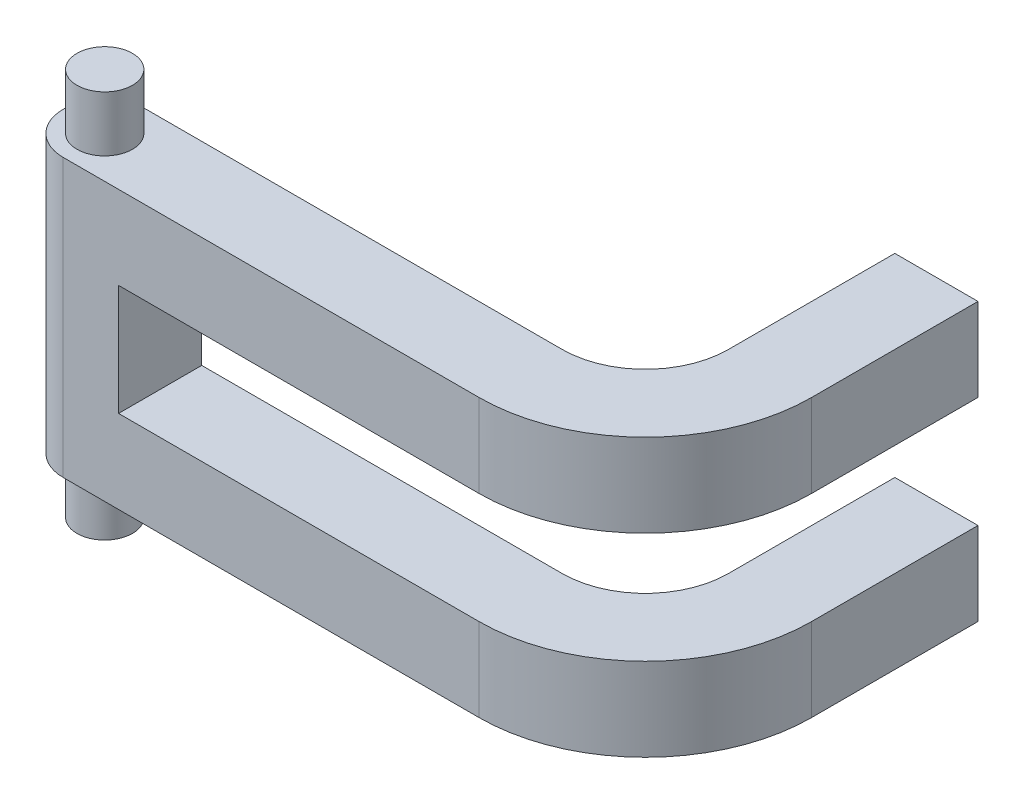
ISO-10303-21;
HEADER;
FILE_DESCRIPTION(('STEP AP214'),'2;1');
FILE_NAME('part.step','',(''),(''),'','','');
FILE_SCHEMA(('AUTOMOTIVE_DESIGN { 1 0 10303 214 1 1 1 1 }'));
ENDSEC;
DATA;
#1=APPLICATION_CONTEXT('core data for automotive mechanical design processes');
#2=APPLICATION_PROTOCOL_DEFINITION('international standard','automotive_design',2000,#1);
#3=PRODUCT_CONTEXT('',#1,'mechanical');
#4=PRODUCT('Part','Part','',(#3));
#5=PRODUCT_RELATED_PRODUCT_CATEGORY('part','',(#4));
#6=PRODUCT_DEFINITION_FORMATION('','',#4);
#7=PRODUCT_DEFINITION_CONTEXT('part definition',#1,'design');
#8=PRODUCT_DEFINITION('design','',#6,#7);
#9=PRODUCT_DEFINITION_SHAPE('','',#8);
#10=(LENGTH_UNIT() NAMED_UNIT(*) SI_UNIT(.MILLI.,.METRE.));
#11=(NAMED_UNIT(*) PLANE_ANGLE_UNIT() SI_UNIT($,.RADIAN.));
#12=(NAMED_UNIT(*) SI_UNIT($,.STERADIAN.) SOLID_ANGLE_UNIT());
#13=UNCERTAINTY_MEASURE_WITH_UNIT(LENGTH_MEASURE(1.E-05),#10,'distance_accuracy_value','');
#14=(GEOMETRIC_REPRESENTATION_CONTEXT(3) GLOBAL_UNCERTAINTY_ASSIGNED_CONTEXT((#13)) GLOBAL_UNIT_ASSIGNED_CONTEXT((#10,
#11,#12)) REPRESENTATION_CONTEXT('',''));
#15=CARTESIAN_POINT('',(0.,0.,0.));
#16=DIRECTION('',(0.,0.,1.));
#17=DIRECTION('',(1.,0.,0.));
#18=AXIS2_PLACEMENT_3D('',#15,#16,#17);
#19=CARTESIAN_POINT('',(75.,-7.5,-30.));
#20=DIRECTION('',(0.,1.,0.));
#21=DIRECTION('',(0.,0.,1.));
#22=AXIS2_PLACEMENT_3D('',#19,#20,#21);
#23=CYLINDRICAL_SURFACE('',#22,15.);
#24=DIRECTION('',(0.,1.,0.));
#25=VECTOR('',#24,1.);
#26=CARTESIAN_POINT('',(90.,-7.5,-30.0000000000001));
#27=LINE('',#26,#25);
#28=CARTESIAN_POINT('',(90.,27.5,-30.0000000000001));
#29=VERTEX_POINT('',#28);
#30=CARTESIAN_POINT('',(90.,42.4982685723538,-30.0000000000001));
#31=VERTEX_POINT('',#30);
#32=EDGE_CURVE('E293',#29,#31,#27,.T.);
#33=ORIENTED_EDGE('',*,*,#32,.F.);
#34=CARTESIAN_POINT('',(75.,27.5,-30.));
#35=DIRECTION('',(0.,-1.,0.));
#36=DIRECTION('',(0.,0.,-1.));
#37=AXIS2_PLACEMENT_3D('',#34,#35,#36);
#38=CIRCLE('',#37,15.);
#39=CARTESIAN_POINT('',(75.,27.5,-15.));
#40=VERTEX_POINT('',#39);
#41=EDGE_CURVE('E181',#29,#40,#38,.T.);
#42=ORIENTED_EDGE('',*,*,#41,.T.);
#43=DIRECTION('',(0.,1.,0.));
#44=VECTOR('',#43,1.);
#45=CARTESIAN_POINT('',(75.,-7.5,-15.));
#46=LINE('',#45,#44);
#47=CARTESIAN_POINT('',(75.,42.4982685723538,-15.));
#48=VERTEX_POINT('',#47);
#49=EDGE_CURVE('E178',#40,#48,#46,.T.);
#50=ORIENTED_EDGE('',*,*,#49,.T.);
#51=CARTESIAN_POINT('',(75.,42.4982685723538,-30.));
#52=DIRECTION('',(0.,-1.,0.));
#53=DIRECTION('',(0.,0.,1.));
#54=AXIS2_PLACEMENT_3D('',#51,#52,#53);
#55=CIRCLE('',#54,15.);
#56=EDGE_CURVE('E243',#31,#48,#55,.T.);
#57=ORIENTED_EDGE('',*,*,#56,.F.);
#58=EDGE_LOOP('',(#33,#42,#50,#57));
#59=FACE_BOUND('',#58,.T.);
#60=ADVANCED_FACE('F40',(#59),#23,.F.);
#61=CARTESIAN_POINT('',(90.,-7.5,-30.0000000000001));
#62=DIRECTION('',(-1.,0.,0.));
#63=DIRECTION('',(0.,0.,1.));
#64=AXIS2_PLACEMENT_3D('',#61,#62,#63);
#65=PLANE('',#64);
#66=DIRECTION('',(0.,1.,0.));
#67=VECTOR('',#66,1.);
#68=CARTESIAN_POINT('',(90.,-7.5,-60.));
#69=LINE('',#68,#67);
#70=CARTESIAN_POINT('',(90.,27.5,-60.));
#71=VERTEX_POINT('',#70);
#72=CARTESIAN_POINT('',(90.,42.4982685723538,-60.));
#73=VERTEX_POINT('',#72);
#74=EDGE_CURVE('E298',#71,#73,#69,.T.);
#75=ORIENTED_EDGE('',*,*,#74,.F.);
#76=DIRECTION('',(0.,0.,1.));
#77=VECTOR('',#76,1.);
#78=CARTESIAN_POINT('',(90.,27.5,-30.0000000000001));
#79=LINE('',#78,#77);
#80=EDGE_CURVE('E187',#71,#29,#79,.T.);
#81=ORIENTED_EDGE('',*,*,#80,.T.);
#82=ORIENTED_EDGE('',*,*,#32,.T.);
#83=DIRECTION('',(0.,0.,1.));
#84=VECTOR('',#83,1.);
#85=CARTESIAN_POINT('',(90.,42.4982685723538,-30.0000000000001));
#86=LINE('',#85,#84);
#87=EDGE_CURVE('E239',#73,#31,#86,.T.);
#88=ORIENTED_EDGE('',*,*,#87,.F.);
#89=EDGE_LOOP('',(#75,#81,#82,#88));
#90=FACE_BOUND('',#89,.T.);
#91=ADVANCED_FACE('F374',(#90),#65,.T.);
#92=CARTESIAN_POINT('',(105.,-7.5,-60.));
#93=DIRECTION('',(0.,0.,-1.));
#94=DIRECTION('',(-1.,0.,0.));
#95=AXIS2_PLACEMENT_3D('',#92,#93,#94);
#96=PLANE('',#95);
#97=DIRECTION('',(0.,1.,0.));
#98=VECTOR('',#97,1.);
#99=CARTESIAN_POINT('',(105.,-7.5,-60.));
#100=LINE('',#99,#98);
#101=CARTESIAN_POINT('',(105.,27.5,-60.));
#102=VERTEX_POINT('',#101);
#103=CARTESIAN_POINT('',(105.,42.4982685723538,-60.));
#104=VERTEX_POINT('',#103);
#105=EDGE_CURVE('E303',#102,#104,#100,.T.);
#106=ORIENTED_EDGE('',*,*,#105,.F.);
#107=DIRECTION('',(-1.,0.,0.));
#108=VECTOR('',#107,1.);
#109=CARTESIAN_POINT('',(105.,27.5,-60.));
#110=LINE('',#109,#108);
#111=EDGE_CURVE('E377',#102,#71,#110,.T.);
#112=ORIENTED_EDGE('',*,*,#111,.T.);
#113=ORIENTED_EDGE('',*,*,#74,.T.);
#114=DIRECTION('',(-1.,0.,0.));
#115=VECTOR('',#114,1.);
#116=CARTESIAN_POINT('',(105.,42.4982685723538,-60.));
#117=LINE('',#116,#115);
#118=EDGE_CURVE('E235',#104,#73,#117,.T.);
#119=ORIENTED_EDGE('',*,*,#118,.F.);
#120=EDGE_LOOP('',(#106,#112,#113,#119));
#121=FACE_BOUND('',#120,.T.);
#122=ADVANCED_FACE('F389',(#121),#96,.T.);
#123=CARTESIAN_POINT('',(105.,-7.5,-30.));
#124=DIRECTION('',(1.,0.,0.));
#125=DIRECTION('',(0.,0.,-1.));
#126=AXIS2_PLACEMENT_3D('',#123,#124,#125);
#127=PLANE('',#126);
#128=DIRECTION('',(0.,1.,0.));
#129=VECTOR('',#128,1.);
#130=CARTESIAN_POINT('',(105.,-7.5,-30.));
#131=LINE('',#130,#129);
#132=CARTESIAN_POINT('',(105.,27.5,-30.));
#133=VERTEX_POINT('',#132);
#134=CARTESIAN_POINT('',(105.,42.4982685723538,-30.));
#135=VERTEX_POINT('',#134);
#136=EDGE_CURVE('E308',#133,#135,#131,.T.);
#137=ORIENTED_EDGE('',*,*,#136,.F.);
#138=DIRECTION('',(0.,0.,-1.));
#139=VECTOR('',#138,1.);
#140=CARTESIAN_POINT('',(105.,27.5,-30.));
#141=LINE('',#140,#139);
#142=EDGE_CURVE('E379',#133,#102,#141,.T.);
#143=ORIENTED_EDGE('',*,*,#142,.T.);
#144=ORIENTED_EDGE('',*,*,#105,.T.);
#145=DIRECTION('',(0.,0.,-1.));
#146=VECTOR('',#145,1.);
#147=CARTESIAN_POINT('',(105.,42.4982685723538,-30.));
#148=LINE('',#147,#146);
#149=EDGE_CURVE('E231',#135,#104,#148,.T.);
#150=ORIENTED_EDGE('',*,*,#149,.F.);
#151=EDGE_LOOP('',(#137,#143,#144,#150));
#152=FACE_BOUND('',#151,.T.);
#153=ADVANCED_FACE('F386',(#152),#127,.T.);
#154=CARTESIAN_POINT('',(75.,-7.5,-30.));
#155=DIRECTION('',(0.,1.,0.));
#156=DIRECTION('',(0.,0.,1.));
#157=AXIS2_PLACEMENT_3D('',#154,#155,#156);
#158=CYLINDRICAL_SURFACE('',#157,30.);
#159=DIRECTION('',(0.,1.,0.));
#160=VECTOR('',#159,1.);
#161=CARTESIAN_POINT('',(75.,-7.5,0.));
#162=LINE('',#161,#160);
#163=CARTESIAN_POINT('',(75.,27.5,0.));
#164=VERTEX_POINT('',#163);
#165=CARTESIAN_POINT('',(75.,42.4982685723538,0.));
#166=VERTEX_POINT('',#165);
#167=EDGE_CURVE('E313',#164,#166,#162,.T.);
#168=ORIENTED_EDGE('',*,*,#167,.F.);
#169=CARTESIAN_POINT('',(75.,27.5,-30.));
#170=DIRECTION('',(0.,-1.,0.));
#171=DIRECTION('',(0.,0.,-1.));
#172=AXIS2_PLACEMENT_3D('',#169,#170,#171);
#173=CIRCLE('',#172,30.);
#174=EDGE_CURVE('E56',#164,#133,#173,.F.);
#175=ORIENTED_EDGE('',*,*,#174,.T.);
#176=ORIENTED_EDGE('',*,*,#136,.T.);
#177=CARTESIAN_POINT('',(75.,42.4982685723538,-30.));
#178=DIRECTION('',(0.,1.,0.));
#179=DIRECTION('',(0.,0.,1.));
#180=AXIS2_PLACEMENT_3D('',#177,#178,#179);
#181=CIRCLE('',#180,30.);
#182=EDGE_CURVE('E227',#166,#135,#181,.T.);
#183=ORIENTED_EDGE('',*,*,#182,.F.);
#184=EDGE_LOOP('',(#168,#175,#176,#183));
#185=FACE_BOUND('',#184,.T.);
#186=ADVANCED_FACE('F358',(#185),#158,.T.);
#187=CARTESIAN_POINT('',(0.,-7.5,-7.5));
#188=DIRECTION('',(0.,1.,0.));
#189=DIRECTION('',(0.,0.,1.));
#190=AXIS2_PLACEMENT_3D('',#187,#188,#189);
#191=CYLINDRICAL_SURFACE('',#190,7.5);
#192=DIRECTION('',(0.,1.,0.));
#193=VECTOR('',#192,1.);
#194=CARTESIAN_POINT('',(0.,-7.5,0.));
#195=LINE('',#194,#193);
#196=CARTESIAN_POINT('',(0.,-7.5,0.));
#197=VERTEX_POINT('',#196);
#198=CARTESIAN_POINT('',(0.,42.4982685723538,0.));
#199=VERTEX_POINT('',#198);
#200=EDGE_CURVE('E282',#197,#199,#195,.T.);
#201=ORIENTED_EDGE('',*,*,#200,.T.);
#202=CARTESIAN_POINT('',(0.,42.4982685723538,-7.5));
#203=DIRECTION('',(0.,1.,0.));
#204=DIRECTION('',(0.,0.,-1.));
#205=AXIS2_PLACEMENT_3D('',#202,#203,#204);
#206=CIRCLE('',#205,7.5);
#207=CARTESIAN_POINT('',(0.,42.4982685723538,-15.));
#208=VERTEX_POINT('',#207);
#209=EDGE_CURVE('E219',#208,#199,#206,.T.);
#210=ORIENTED_EDGE('',*,*,#209,.F.);
#211=DIRECTION('',(0.,1.,0.));
#212=VECTOR('',#211,1.);
#213=CARTESIAN_POINT('',(0.,-7.5,-15.));
#214=LINE('',#213,#212);
#215=CARTESIAN_POINT('',(0.,-7.5,-15.));
#216=VERTEX_POINT('',#215);
#217=EDGE_CURVE('E64',#216,#208,#214,.T.);
#218=ORIENTED_EDGE('',*,*,#217,.F.);
#219=CARTESIAN_POINT('',(0.,-7.5,-7.5));
#220=DIRECTION('',(0.,1.,0.));
#221=DIRECTION('',(0.,0.,-1.));
#222=AXIS2_PLACEMENT_3D('',#219,#220,#221);
#223=CIRCLE('',#222,7.5);
#224=EDGE_CURVE('E251',#216,#197,#223,.T.);
#225=ORIENTED_EDGE('',*,*,#224,.T.);
#226=EDGE_LOOP('',(#201,#210,#218,#225));
#227=FACE_BOUND('',#226,.T.);
#228=ADVANCED_FACE('F42',(#227),#191,.T.);
#229=CARTESIAN_POINT('',(0.,-7.5,-15.));
#230=DIRECTION('',(0.,0.,-1.));
#231=DIRECTION('',(-1.,0.,0.));
#232=AXIS2_PLACEMENT_3D('',#229,#230,#231);
#233=PLANE('',#232);
#234=DIRECTION('',(-1.,0.,0.));
#235=VECTOR('',#234,1.);
#236=CARTESIAN_POINT('',(0.,7.5,-15.));
#237=LINE('',#236,#235);
#238=CARTESIAN_POINT('',(75.,7.5,-15.));
#239=VERTEX_POINT('',#238);
#240=CARTESIAN_POINT('',(10.,7.5,-15.));
#241=VERTEX_POINT('',#240);
#242=EDGE_CURVE('E167',#239,#241,#237,.T.);
#243=ORIENTED_EDGE('',*,*,#242,.F.);
#244=CARTESIAN_POINT('',(75.,-7.5,-15.));
#245=VERTEX_POINT('',#244);
#246=EDGE_CURVE('E285',#245,#239,#46,.T.);
#247=ORIENTED_EDGE('',*,*,#246,.F.);
#248=DIRECTION('',(-1.,0.,0.));
#249=VECTOR('',#248,1.);
#250=CARTESIAN_POINT('',(0.,-7.5,-15.));
#251=LINE('',#250,#249);
#252=EDGE_CURVE('E278',#245,#216,#251,.T.);
#253=ORIENTED_EDGE('',*,*,#252,.T.);
#254=ORIENTED_EDGE('',*,*,#217,.T.);
#255=DIRECTION('',(-1.,0.,0.));
#256=VECTOR('',#255,1.);
#257=CARTESIAN_POINT('',(0.,42.4982685723538,-15.));
#258=LINE('',#257,#256);
#259=EDGE_CURVE('E247',#48,#208,#258,.T.);
#260=ORIENTED_EDGE('',*,*,#259,.F.);
#261=ORIENTED_EDGE('',*,*,#49,.F.);
#262=DIRECTION('',(-1.,0.,0.));
#263=VECTOR('',#262,1.);
#264=CARTESIAN_POINT('',(0.,27.5,-15.));
#265=LINE('',#264,#263);
#266=CARTESIAN_POINT('',(10.,27.5,-15.));
#267=VERTEX_POINT('',#266);
#268=EDGE_CURVE('E170',#40,#267,#265,.T.);
#269=ORIENTED_EDGE('',*,*,#268,.T.);
#270=DIRECTION('',(0.,1.,0.));
#271=VECTOR('',#270,1.);
#272=CARTESIAN_POINT('',(10.,-7.5,-15.));
#273=LINE('',#272,#271);
#274=EDGE_CURVE('E155',#241,#267,#273,.T.);
#275=ORIENTED_EDGE('',*,*,#274,.F.);
#276=EDGE_LOOP('',(#243,#247,#253,#254,#260,#261,#269,#275));
#277=FACE_BOUND('',#276,.T.);
#278=ADVANCED_FACE('F176',(#277),#233,.T.);
#279=CARTESIAN_POINT('',(75.,7.5,-30.));
#280=DIRECTION('',(0.,-1.,0.));
#281=DIRECTION('',(0.,0.,-1.));
#282=AXIS2_PLACEMENT_3D('',#279,#280,#281);
#283=CIRCLE('',#282,15.);
#284=CARTESIAN_POINT('',(90.,7.5,-30.0000000000001));
#285=VERTEX_POINT('',#284);
#286=EDGE_CURVE('E199',#285,#239,#283,.T.);
#287=ORIENTED_EDGE('',*,*,#286,.F.);
#288=CARTESIAN_POINT('',(90.,-7.5,-30.0000000000001));
#289=VERTEX_POINT('',#288);
#290=EDGE_CURVE('E289',#289,#285,#27,.T.);
#291=ORIENTED_EDGE('',*,*,#290,.F.);
#292=CARTESIAN_POINT('',(75.,-7.5,-30.));
#293=DIRECTION('',(0.,-1.,0.));
#294=DIRECTION('',(0.,0.,1.));
#295=AXIS2_PLACEMENT_3D('',#292,#293,#294);
#296=CIRCLE('',#295,15.);
#297=EDGE_CURVE('E274',#289,#245,#296,.T.);
#298=ORIENTED_EDGE('',*,*,#297,.T.);
#299=ORIENTED_EDGE('',*,*,#246,.T.);
#300=EDGE_LOOP('',(#287,#291,#298,#299));
#301=FACE_BOUND('',#300,.T.);
#302=ADVANCED_FACE('F348',(#301),#23,.F.);
#303=DIRECTION('',(0.,0.,1.));
#304=VECTOR('',#303,1.);
#305=CARTESIAN_POINT('',(90.,7.5,-30.0000000000001));
#306=LINE('',#305,#304);
#307=CARTESIAN_POINT('',(90.,7.5,-60.));
#308=VERTEX_POINT('',#307);
#309=EDGE_CURVE('E196',#308,#285,#306,.T.);
#310=ORIENTED_EDGE('',*,*,#309,.F.);
#311=CARTESIAN_POINT('',(90.,-7.5,-60.));
#312=VERTEX_POINT('',#311);
#313=EDGE_CURVE('E294',#312,#308,#69,.T.);
#314=ORIENTED_EDGE('',*,*,#313,.F.);
#315=DIRECTION('',(0.,0.,1.));
#316=VECTOR('',#315,1.);
#317=CARTESIAN_POINT('',(90.,-7.5,-30.0000000000001));
#318=LINE('',#317,#316);
#319=EDGE_CURVE('E270',#312,#289,#318,.T.);
#320=ORIENTED_EDGE('',*,*,#319,.T.);
#321=ORIENTED_EDGE('',*,*,#290,.T.);
#322=EDGE_LOOP('',(#310,#314,#320,#321));
#323=FACE_BOUND('',#322,.T.);
#324=ADVANCED_FACE('F343',(#323),#65,.T.);
#325=DIRECTION('',(-1.,0.,0.));
#326=VECTOR('',#325,1.);
#327=CARTESIAN_POINT('',(105.,7.5,-60.));
#328=LINE('',#327,#326);
#329=CARTESIAN_POINT('',(105.,7.5,-60.));
#330=VERTEX_POINT('',#329);
#331=EDGE_CURVE('E193',#330,#308,#328,.T.);
#332=ORIENTED_EDGE('',*,*,#331,.F.);
#333=CARTESIAN_POINT('',(105.,-7.5,-60.));
#334=VERTEX_POINT('',#333);
#335=EDGE_CURVE('E299',#334,#330,#100,.T.);
#336=ORIENTED_EDGE('',*,*,#335,.F.);
#337=DIRECTION('',(-1.,0.,0.));
#338=VECTOR('',#337,1.);
#339=CARTESIAN_POINT('',(105.,-7.5,-60.));
#340=LINE('',#339,#338);
#341=EDGE_CURVE('E266',#334,#312,#340,.T.);
#342=ORIENTED_EDGE('',*,*,#341,.T.);
#343=ORIENTED_EDGE('',*,*,#313,.T.);
#344=EDGE_LOOP('',(#332,#336,#342,#343));
#345=FACE_BOUND('',#344,.T.);
#346=ADVANCED_FACE('F341',(#345),#96,.T.);
#347=DIRECTION('',(0.,0.,-1.));
#348=VECTOR('',#347,1.);
#349=CARTESIAN_POINT('',(105.,7.5,-30.));
#350=LINE('',#349,#348);
#351=CARTESIAN_POINT('',(105.,7.5,-30.));
#352=VERTEX_POINT('',#351);
#353=EDGE_CURVE('E185',#352,#330,#350,.T.);
#354=ORIENTED_EDGE('',*,*,#353,.F.);
#355=CARTESIAN_POINT('',(105.,-7.5,-30.));
#356=VERTEX_POINT('',#355);
#357=EDGE_CURVE('E304',#356,#352,#131,.T.);
#358=ORIENTED_EDGE('',*,*,#357,.F.);
#359=DIRECTION('',(0.,0.,-1.));
#360=VECTOR('',#359,1.);
#361=CARTESIAN_POINT('',(105.,-7.5,-30.));
#362=LINE('',#361,#360);
#363=EDGE_CURVE('E262',#356,#334,#362,.T.);
#364=ORIENTED_EDGE('',*,*,#363,.T.);
#365=ORIENTED_EDGE('',*,*,#335,.T.);
#366=EDGE_LOOP('',(#354,#358,#364,#365));
#367=FACE_BOUND('',#366,.T.);
#368=ADVANCED_FACE('F337',(#367),#127,.T.);
#369=CARTESIAN_POINT('',(75.,7.5,-30.));
#370=DIRECTION('',(0.,-1.,0.));
#371=DIRECTION('',(0.,0.,-1.));
#372=AXIS2_PLACEMENT_3D('',#369,#370,#371);
#373=CIRCLE('',#372,30.);
#374=CARTESIAN_POINT('',(75.,7.5,0.));
#375=VERTEX_POINT('',#374);
#376=EDGE_CURVE('E180',#375,#352,#373,.F.);
#377=ORIENTED_EDGE('',*,*,#376,.F.);
#378=CARTESIAN_POINT('',(75.,-7.5,0.));
#379=VERTEX_POINT('',#378);
#380=EDGE_CURVE('E309',#379,#375,#162,.T.);
#381=ORIENTED_EDGE('',*,*,#380,.F.);
#382=CARTESIAN_POINT('',(75.,-7.5,-30.));
#383=DIRECTION('',(0.,1.,0.));
#384=DIRECTION('',(0.,0.,1.));
#385=AXIS2_PLACEMENT_3D('',#382,#383,#384);
#386=CIRCLE('',#385,30.);
#387=EDGE_CURVE('E258',#379,#356,#386,.T.);
#388=ORIENTED_EDGE('',*,*,#387,.T.);
#389=ORIENTED_EDGE('',*,*,#357,.T.);
#390=EDGE_LOOP('',(#377,#381,#388,#389));
#391=FACE_BOUND('',#390,.T.);
#392=ADVANCED_FACE('F329',(#391),#158,.T.);
#393=CARTESIAN_POINT('',(0.,-7.5,0.));
#394=DIRECTION('',(0.,0.,1.));
#395=DIRECTION('',(1.,0.,0.));
#396=AXIS2_PLACEMENT_3D('',#393,#394,#395);
#397=PLANE('',#396);
#398=DIRECTION('',(1.,0.,0.));
#399=VECTOR('',#398,1.);
#400=CARTESIAN_POINT('',(0.,7.5,0.));
#401=LINE('',#400,#399);
#402=CARTESIAN_POINT('',(10.,7.5,0.));
#403=VERTEX_POINT('',#402);
#404=EDGE_CURVE('E11',#403,#375,#401,.T.);
#405=ORIENTED_EDGE('',*,*,#404,.F.);
#406=DIRECTION('',(0.,-1.,0.));
#407=VECTOR('',#406,1.);
#408=CARTESIAN_POINT('',(10.,-7.5,0.));
#409=LINE('',#408,#407);
#410=CARTESIAN_POINT('',(10.,27.5,0.));
#411=VERTEX_POINT('',#410);
#412=EDGE_CURVE('E49',#411,#403,#409,.T.);
#413=ORIENTED_EDGE('',*,*,#412,.F.);
#414=DIRECTION('',(1.,0.,0.));
#415=VECTOR('',#414,1.);
#416=CARTESIAN_POINT('',(0.,27.5,0.));
#417=LINE('',#416,#415);
#418=EDGE_CURVE('E172',#411,#164,#417,.T.);
#419=ORIENTED_EDGE('',*,*,#418,.T.);
#420=ORIENTED_EDGE('',*,*,#167,.T.);
#421=DIRECTION('',(1.,0.,0.));
#422=VECTOR('',#421,1.);
#423=CARTESIAN_POINT('',(0.,42.4982685723538,0.));
#424=LINE('',#423,#422);
#425=EDGE_CURVE('E223',#199,#166,#424,.T.);
#426=ORIENTED_EDGE('',*,*,#425,.F.);
#427=ORIENTED_EDGE('',*,*,#200,.F.);
#428=DIRECTION('',(1.,0.,0.));
#429=VECTOR('',#428,1.);
#430=CARTESIAN_POINT('',(0.,-7.5,0.));
#431=LINE('',#430,#429);
#432=EDGE_CURVE('E254',#197,#379,#431,.T.);
#433=ORIENTED_EDGE('',*,*,#432,.T.);
#434=ORIENTED_EDGE('',*,*,#380,.T.);
#435=EDGE_LOOP('',(#405,#413,#419,#420,#426,#427,#433,#434));
#436=FACE_BOUND('',#435,.T.);
#437=ADVANCED_FACE('F325',(#436),#397,.T.);
#438=CARTESIAN_POINT('',(0.,-7.5,-7.5));
#439=DIRECTION('',(0.,-1.,0.));
#440=DIRECTION('',(0.,0.,-1.));
#441=AXIS2_PLACEMENT_3D('',#438,#439,#440);
#442=PLANE('',#441);
#443=CARTESIAN_POINT('',(0.,-7.5,-7.5));
#444=DIRECTION('',(0.,-1.,0.));
#445=DIRECTION('',(0.,0.,-1.));
#446=AXIS2_PLACEMENT_3D('',#443,#444,#445);
#447=CIRCLE('',#446,5.);
#448=CARTESIAN_POINT('',(0.,-7.5,-12.5));
#449=VERTEX_POINT('',#448);
#450=EDGE_CURVE('E211',#449,#449,#447,.T.);
#451=ORIENTED_EDGE('',*,*,#450,.F.);
#452=EDGE_LOOP('',(#451));
#453=FACE_BOUND('',#452,.T.);
#454=ORIENTED_EDGE('',*,*,#224,.F.);
#455=ORIENTED_EDGE('',*,*,#252,.F.);
#456=ORIENTED_EDGE('',*,*,#297,.F.);
#457=ORIENTED_EDGE('',*,*,#319,.F.);
#458=ORIENTED_EDGE('',*,*,#341,.F.);
#459=ORIENTED_EDGE('',*,*,#363,.F.);
#460=ORIENTED_EDGE('',*,*,#387,.F.);
#461=ORIENTED_EDGE('',*,*,#432,.F.);
#462=EDGE_LOOP('',(#454,#455,#456,#457,#458,#459,#460,#461));
#463=FACE_BOUND('',#462,.T.);
#464=ADVANCED_FACE('F332',(#453,#463),#442,.T.);
#465=CARTESIAN_POINT('',(0.,42.4982685723538,-7.5));
#466=DIRECTION('',(0.,-1.,0.));
#467=DIRECTION('',(0.,0.,-1.));
#468=AXIS2_PLACEMENT_3D('',#465,#466,#467);
#469=PLANE('',#468);
#470=ORIENTED_EDGE('',*,*,#209,.T.);
#471=ORIENTED_EDGE('',*,*,#425,.T.);
#472=ORIENTED_EDGE('',*,*,#182,.T.);
#473=ORIENTED_EDGE('',*,*,#149,.T.);
#474=ORIENTED_EDGE('',*,*,#118,.T.);
#475=ORIENTED_EDGE('',*,*,#87,.T.);
#476=ORIENTED_EDGE('',*,*,#56,.T.);
#477=ORIENTED_EDGE('',*,*,#259,.T.);
#478=EDGE_LOOP('',(#470,#471,#472,#473,#474,#475,#476,#477));
#479=FACE_BOUND('',#478,.T.);
#480=CARTESIAN_POINT('',(0.,42.4982685723538,-7.5));
#481=DIRECTION('',(0.,1.,0.));
#482=DIRECTION('',(0.,0.,1.));
#483=AXIS2_PLACEMENT_3D('',#480,#481,#482);
#484=CIRCLE('',#483,5.);
#485=CARTESIAN_POINT('',(0.,42.4982685723538,-2.5));
#486=VERTEX_POINT('',#485);
#487=EDGE_CURVE('E215',#486,#486,#484,.T.);
#488=ORIENTED_EDGE('',*,*,#487,.F.);
#489=EDGE_LOOP('',(#488));
#490=FACE_BOUND('',#489,.T.);
#491=ADVANCED_FACE('F350',(#479,#490),#469,.F.);
#492=CARTESIAN_POINT('',(0.,-17.5,-7.5));
#493=DIRECTION('',(0.,1.,0.));
#494=DIRECTION('',(0.,0.,1.));
#495=AXIS2_PLACEMENT_3D('',#492,#493,#494);
#496=CYLINDRICAL_SURFACE('',#495,5.);
#497=ORIENTED_EDGE('',*,*,#450,.T.);
#498=EDGE_LOOP('',(#497));
#499=FACE_BOUND('',#498,.T.);
#500=CARTESIAN_POINT('',(0.,-17.5,-7.5));
#501=DIRECTION('',(0.,1.,0.));
#502=DIRECTION('',(0.,0.,1.));
#503=AXIS2_PLACEMENT_3D('',#500,#501,#502);
#504=CIRCLE('',#503,5.);
#505=CARTESIAN_POINT('',(0.,-17.5,-2.5));
#506=VERTEX_POINT('',#505);
#507=EDGE_CURVE('E207',#506,#506,#504,.T.);
#508=ORIENTED_EDGE('',*,*,#507,.T.);
#509=EDGE_LOOP('',(#508));
#510=FACE_BOUND('',#509,.T.);
#511=ADVANCED_FACE('F418',(#499,#510),#496,.T.);
#512=CARTESIAN_POINT('',(0.,-17.5,-7.5));
#513=DIRECTION('',(0.,1.,0.));
#514=DIRECTION('',(0.,0.,1.));
#515=AXIS2_PLACEMENT_3D('',#512,#513,#514);
#516=PLANE('',#515);
#517=ORIENTED_EDGE('',*,*,#507,.F.);
#518=EDGE_LOOP('',(#517));
#519=FACE_BOUND('',#518,.T.);
#520=ADVANCED_FACE('F421',(#519),#516,.F.);
#521=CARTESIAN_POINT('',(0.,66.642135623731,-7.5));
#522=DIRECTION('',(0.,-1.,0.));
#523=DIRECTION('',(0.,0.,-1.));
#524=AXIS2_PLACEMENT_3D('',#521,#522,#523);
#525=CYLINDRICAL_SURFACE('',#524,5.);
#526=CARTESIAN_POINT('',(0.,52.5,-7.5));
#527=DIRECTION('',(0.,1.,0.));
#528=DIRECTION('',(0.,0.,1.));
#529=AXIS2_PLACEMENT_3D('',#526,#527,#528);
#530=CIRCLE('',#529,5.);
#531=CARTESIAN_POINT('',(0.,52.5,-2.5));
#532=VERTEX_POINT('',#531);
#533=EDGE_CURVE('E166',#532,#532,#530,.T.);
#534=ORIENTED_EDGE('',*,*,#533,.F.);
#535=EDGE_LOOP('',(#534));
#536=FACE_BOUND('',#535,.T.);
#537=ORIENTED_EDGE('',*,*,#487,.T.);
#538=EDGE_LOOP('',(#537));
#539=FACE_BOUND('',#538,.T.);
#540=ADVANCED_FACE('F425',(#536,#539),#525,.T.);
#541=CARTESIAN_POINT('',(0.,52.5,0.));
#542=DIRECTION('',(0.,1.,0.));
#543=DIRECTION('',(0.,0.,1.));
#544=AXIS2_PLACEMENT_3D('',#541,#542,#543);
#545=PLANE('',#544);
#546=ORIENTED_EDGE('',*,*,#533,.T.);
#547=EDGE_LOOP('',(#546));
#548=FACE_BOUND('',#547,.T.);
#549=ADVANCED_FACE('F427',(#548),#545,.T.);
#550=CARTESIAN_POINT('',(10.,7.5,1.35035731198608));
#551=DIRECTION('',(-1.,0.,0.));
#552=DIRECTION('',(0.,0.,1.));
#553=AXIS2_PLACEMENT_3D('',#550,#551,#552);
#554=PLANE('',#553);
#555=ORIENTED_EDGE('',*,*,#274,.T.);
#556=DIRECTION('',(0.,0.,1.));
#557=VECTOR('',#556,1.);
#558=CARTESIAN_POINT('',(10.,27.5,1.35035731198608));
#559=LINE('',#558,#557);
#560=EDGE_CURVE('E158',#267,#411,#559,.T.);
#561=ORIENTED_EDGE('',*,*,#560,.T.);
#562=ORIENTED_EDGE('',*,*,#412,.T.);
#563=DIRECTION('',(0.,0.,1.));
#564=VECTOR('',#563,1.);
#565=CARTESIAN_POINT('',(10.,7.5,1.35035731198608));
#566=LINE('',#565,#564);
#567=EDGE_CURVE('E161',#241,#403,#566,.T.);
#568=ORIENTED_EDGE('',*,*,#567,.F.);
#569=EDGE_LOOP('',(#555,#561,#562,#568));
#570=FACE_BOUND('',#569,.T.);
#571=ADVANCED_FACE('F157',(#570),#554,.F.);
#572=CARTESIAN_POINT('',(0.,7.5,0.));
#573=DIRECTION('',(0.,-1.,0.));
#574=DIRECTION('',(0.,0.,-1.));
#575=AXIS2_PLACEMENT_3D('',#572,#573,#574);
#576=PLANE('',#575);
#577=ORIENTED_EDGE('',*,*,#242,.T.);
#578=ORIENTED_EDGE('',*,*,#567,.T.);
#579=ORIENTED_EDGE('',*,*,#404,.T.);
#580=ORIENTED_EDGE('',*,*,#376,.T.);
#581=ORIENTED_EDGE('',*,*,#353,.T.);
#582=ORIENTED_EDGE('',*,*,#331,.T.);
#583=ORIENTED_EDGE('',*,*,#309,.T.);
#584=ORIENTED_EDGE('',*,*,#286,.T.);
#585=EDGE_LOOP('',(#577,#578,#579,#580,#581,#582,#583,#584));
#586=FACE_BOUND('',#585,.T.);
#587=ADVANCED_FACE('F321',(#586),#576,.F.);
#588=CARTESIAN_POINT('',(0.,27.5,0.));
#589=DIRECTION('',(0.,-1.,0.));
#590=DIRECTION('',(0.,0.,-1.));
#591=AXIS2_PLACEMENT_3D('',#588,#589,#590);
#592=PLANE('',#591);
#593=ORIENTED_EDGE('',*,*,#41,.F.);
#594=ORIENTED_EDGE('',*,*,#80,.F.);
#595=ORIENTED_EDGE('',*,*,#111,.F.);
#596=ORIENTED_EDGE('',*,*,#142,.F.);
#597=ORIENTED_EDGE('',*,*,#174,.F.);
#598=ORIENTED_EDGE('',*,*,#418,.F.);
#599=ORIENTED_EDGE('',*,*,#560,.F.);
#600=ORIENTED_EDGE('',*,*,#268,.F.);
#601=EDGE_LOOP('',(#593,#594,#595,#596,#597,#598,#599,#600));
#602=FACE_BOUND('',#601,.T.);
#603=ADVANCED_FACE('F169',(#602),#592,.T.);
#604=CLOSED_SHELL('',(#60,#91,#122,#153,#186,#228,#278,#302,#324,#346,#368,#392,#437,#464,#491,
#511,#520,#540,#549,#571,#587,#603));
#605=MANIFOLD_SOLID_BREP('B2',#604);
#606=ADVANCED_BREP_SHAPE_REPRESENTATION('',(#18,#605),#14);
#607=SHAPE_DEFINITION_REPRESENTATION(#9,#606);
ENDSEC;
END-ISO-10303-21;
